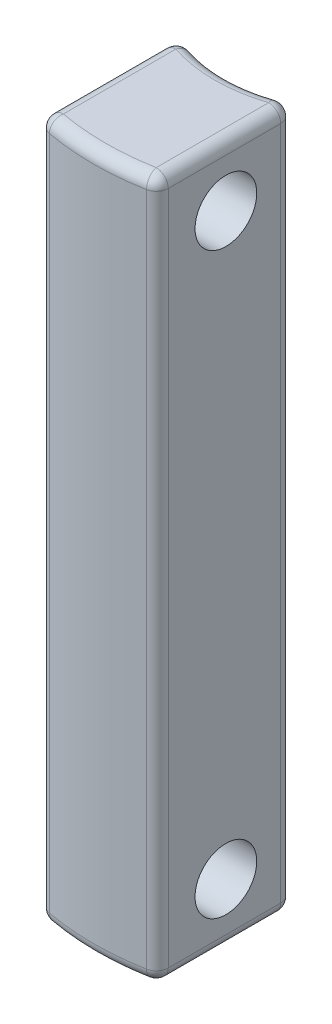
ISO-10303-21;
HEADER;
FILE_DESCRIPTION(('STEP AP214'),'2;1');
FILE_NAME('part.step','',(''),(''),'','','');
FILE_SCHEMA(('AUTOMOTIVE_DESIGN { 1 0 10303 214 1 1 1 1 }'));
ENDSEC;
DATA;
#1=APPLICATION_CONTEXT('core data for automotive mechanical design processes');
#2=APPLICATION_PROTOCOL_DEFINITION('international standard','automotive_design',2000,#1);
#3=PRODUCT_CONTEXT('',#1,'mechanical');
#4=PRODUCT('Part','Part','',(#3));
#5=PRODUCT_RELATED_PRODUCT_CATEGORY('part','',(#4));
#6=PRODUCT_DEFINITION_FORMATION('','',#4);
#7=PRODUCT_DEFINITION_CONTEXT('part definition',#1,'design');
#8=PRODUCT_DEFINITION('design','',#6,#7);
#9=PRODUCT_DEFINITION_SHAPE('','',#8);
#10=(LENGTH_UNIT() NAMED_UNIT(*) SI_UNIT(.MILLI.,.METRE.));
#11=(NAMED_UNIT(*) PLANE_ANGLE_UNIT() SI_UNIT($,.RADIAN.));
#12=(NAMED_UNIT(*) SI_UNIT($,.STERADIAN.) SOLID_ANGLE_UNIT());
#13=UNCERTAINTY_MEASURE_WITH_UNIT(LENGTH_MEASURE(1.E-05),#10,'distance_accuracy_value','');
#14=(GEOMETRIC_REPRESENTATION_CONTEXT(3) GLOBAL_UNCERTAINTY_ASSIGNED_CONTEXT((#13)) GLOBAL_UNIT_ASSIGNED_CONTEXT((#10,
#11,#12)) REPRESENTATION_CONTEXT('',''));
#15=CARTESIAN_POINT('',(0.,0.,0.));
#16=DIRECTION('',(0.,0.,1.));
#17=DIRECTION('',(1.,0.,0.));
#18=AXIS2_PLACEMENT_3D('',#15,#16,#17);
#19=CARTESIAN_POINT('',(0.,-54.61,0.));
#20=DIRECTION('',(0.,1.,0.));
#21=DIRECTION('',(0.,0.,1.));
#22=AXIS2_PLACEMENT_3D('',#19,#20,#21);
#23=CYLINDRICAL_SURFACE('',#22,14.3764);
#24=DIRECTION('',(0.,1.,0.));
#25=VECTOR('',#24,1.);
#26=CARTESIAN_POINT('',(4.492625,-54.61,13.6563976790871));
#27=LINE('',#26,#25);
#28=CARTESIAN_POINT('',(4.492625,17.78,13.6563976790871));
#29=VERTEX_POINT('',#28);
#30=CARTESIAN_POINT('',(4.492625,-53.34,13.6563976790871));
#31=VERTEX_POINT('',#30);
#32=EDGE_CURVE('E199',#29,#31,#27,.F.);
#33=ORIENTED_EDGE('',*,*,#32,.T.);
#34=CARTESIAN_POINT('',(0.,-53.34,0.));
#35=DIRECTION('',(0.,1.,0.));
#36=DIRECTION('',(0.,0.,1.));
#37=AXIS2_PLACEMENT_3D('',#34,#35,#36);
#38=CIRCLE('',#37,14.3764);
#39=CARTESIAN_POINT('',(-4.492625,-53.34,13.6563976790871));
#40=VERTEX_POINT('',#39);
#41=EDGE_CURVE('E204',#31,#40,#38,.F.);
#42=ORIENTED_EDGE('',*,*,#41,.T.);
#43=DIRECTION('',(0.,1.,0.));
#44=VECTOR('',#43,1.);
#45=CARTESIAN_POINT('',(-4.492625,-54.61,13.6563976790871));
#46=LINE('',#45,#44);
#47=CARTESIAN_POINT('',(-4.492625,17.78,13.6563976790871));
#48=VERTEX_POINT('',#47);
#49=EDGE_CURVE('E201',#40,#48,#46,.T.);
#50=ORIENTED_EDGE('',*,*,#49,.T.);
#51=CARTESIAN_POINT('',(0.,17.78,0.));
#52=DIRECTION('',(0.,1.,0.));
#53=DIRECTION('',(0.,0.,1.));
#54=AXIS2_PLACEMENT_3D('',#51,#52,#53);
#55=CIRCLE('',#54,14.3764);
#56=EDGE_CURVE('E197',#48,#29,#55,.T.);
#57=ORIENTED_EDGE('',*,*,#56,.T.);
#58=EDGE_LOOP('',(#33,#42,#50,#57));
#59=FACE_BOUND('',#58,.T.);
#60=ADVANCED_FACE('F32',(#59),#23,.F.);
#61=CARTESIAN_POINT('',(6.1595,-54.61,12.9900514513993));
#62=DIRECTION('',(1.,0.,0.));
#63=DIRECTION('',(0.,0.,-1.));
#64=AXIS2_PLACEMENT_3D('',#61,#62,#63);
#65=PLANE('',#64);
#66=DIRECTION('',(0.,0.,-1.));
#67=VECTOR('',#66,1.);
#68=CARTESIAN_POINT('',(6.1595,17.78,12.9900514513993));
#69=LINE('',#68,#67);
#70=CARTESIAN_POINT('',(6.1595,17.78,14.8627932337767));
#71=VERTEX_POINT('',#70);
#72=CARTESIAN_POINT('',(6.15950000000001,17.78,26.7087340866242));
#73=VERTEX_POINT('',#72);
#74=EDGE_CURVE('E143',#71,#73,#69,.F.);
#75=ORIENTED_EDGE('',*,*,#74,.T.);
#76=DIRECTION('',(0.,1.,0.));
#77=VECTOR('',#76,1.);
#78=CARTESIAN_POINT('',(6.15950000000001,-54.61,26.7087340866242));
#79=LINE('',#78,#77);
#80=CARTESIAN_POINT('',(6.15950000000001,-53.34,26.7087340866242));
#81=VERTEX_POINT('',#80);
#82=EDGE_CURVE('E186',#73,#81,#79,.F.);
#83=ORIENTED_EDGE('',*,*,#82,.T.);
#84=DIRECTION('',(0.,0.,-1.));
#85=VECTOR('',#84,1.);
#86=CARTESIAN_POINT('',(6.1595,-53.34,12.9900514513993));
#87=LINE('',#86,#85);
#88=CARTESIAN_POINT('',(6.1595,-53.34,14.8627932337767));
#89=VERTEX_POINT('',#88);
#90=EDGE_CURVE('E183',#81,#89,#87,.T.);
#91=ORIENTED_EDGE('',*,*,#90,.T.);
#92=DIRECTION('',(0.,1.,0.));
#93=VECTOR('',#92,1.);
#94=CARTESIAN_POINT('',(6.1595,-54.61,14.8627932337767));
#95=LINE('',#94,#93);
#96=EDGE_CURVE('E181',#89,#71,#95,.T.);
#97=ORIENTED_EDGE('',*,*,#96,.T.);
#98=EDGE_LOOP('',(#75,#83,#91,#97));
#99=FACE_BOUND('',#98,.T.);
#100=CARTESIAN_POINT('',(6.1595,-48.26,20.6375));
#101=DIRECTION('',(1.,0.,0.));
#102=DIRECTION('',(0.,0.,-1.));
#103=AXIS2_PLACEMENT_3D('',#100,#101,#102);
#104=CIRCLE('',#103,3.2512);
#105=CARTESIAN_POINT('',(6.1595,-48.26,17.3863));
#106=VERTEX_POINT('',#105);
#107=EDGE_CURVE('E266',#106,#106,#104,.T.);
#108=ORIENTED_EDGE('',*,*,#107,.F.);
#109=EDGE_LOOP('',(#108));
#110=FACE_BOUND('',#109,.T.);
#111=CARTESIAN_POINT('',(6.1595,12.7,20.6375));
#112=DIRECTION('',(1.,0.,0.));
#113=DIRECTION('',(0.,0.,-1.));
#114=AXIS2_PLACEMENT_3D('',#111,#112,#113);
#115=CIRCLE('',#114,3.2512);
#116=CARTESIAN_POINT('',(6.1595,12.7,17.3863));
#117=VERTEX_POINT('',#116);
#118=EDGE_CURVE('E161',#117,#117,#115,.T.);
#119=ORIENTED_EDGE('',*,*,#118,.F.);
#120=EDGE_LOOP('',(#119));
#121=FACE_BOUND('',#120,.T.);
#122=ADVANCED_FACE('F290',(#99,#110,#121),#65,.T.);
#123=CARTESIAN_POINT('',(0.,-54.61,0.));
#124=DIRECTION('',(0.,1.,0.));
#125=DIRECTION('',(0.,0.,1.));
#126=AXIS2_PLACEMENT_3D('',#123,#124,#125);
#127=CYLINDRICAL_SURFACE('',#126,28.4226);
#128=DIRECTION('',(0.,1.,0.));
#129=VECTOR('',#128,1.);
#130=CARTESIAN_POINT('',(-5.11819504209541,-54.61,27.9579732861857));
#131=LINE('',#130,#129);
#132=CARTESIAN_POINT('',(-5.11819504209541,17.78,27.9579732861856));
#133=VERTEX_POINT('',#132);
#134=CARTESIAN_POINT('',(-5.11819504209541,-53.34,27.9579732861856));
#135=VERTEX_POINT('',#134);
#136=EDGE_CURVE('E41',#133,#135,#131,.F.);
#137=ORIENTED_EDGE('',*,*,#136,.T.);
#138=CARTESIAN_POINT('',(0.,-53.34,0.));
#139=DIRECTION('',(0.,1.,0.));
#140=DIRECTION('',(0.,0.,1.));
#141=AXIS2_PLACEMENT_3D('',#138,#139,#140);
#142=CIRCLE('',#141,28.4226);
#143=CARTESIAN_POINT('',(5.11819504209542,-53.34,27.9579732861856));
#144=VERTEX_POINT('',#143);
#145=EDGE_CURVE('E11',#135,#144,#142,.T.);
#146=ORIENTED_EDGE('',*,*,#145,.T.);
#147=DIRECTION('',(0.,1.,0.));
#148=VECTOR('',#147,1.);
#149=CARTESIAN_POINT('',(5.11819504209542,-54.61,27.9579732861856));
#150=LINE('',#149,#148);
#151=CARTESIAN_POINT('',(5.11819504209542,17.78,27.9579732861856));
#152=VERTEX_POINT('',#151);
#153=EDGE_CURVE('E208',#144,#152,#150,.T.);
#154=ORIENTED_EDGE('',*,*,#153,.T.);
#155=CARTESIAN_POINT('',(0.,17.78,0.));
#156=DIRECTION('',(0.,1.,0.));
#157=DIRECTION('',(0.,0.,1.));
#158=AXIS2_PLACEMENT_3D('',#155,#156,#157);
#159=CIRCLE('',#158,28.4226);
#160=EDGE_CURVE('E206',#152,#133,#159,.F.);
#161=ORIENTED_EDGE('',*,*,#160,.T.);
#162=EDGE_LOOP('',(#137,#146,#154,#161));
#163=FACE_BOUND('',#162,.T.);
#164=ADVANCED_FACE('F281',(#163),#127,.T.);
#165=CARTESIAN_POINT('',(-6.1595,-54.61,12.9900514513993));
#166=DIRECTION('',(-1.,0.,0.));
#167=DIRECTION('',(0.,0.,1.));
#168=AXIS2_PLACEMENT_3D('',#165,#166,#167);
#169=PLANE('',#168);
#170=DIRECTION('',(0.,0.,1.));
#171=VECTOR('',#170,1.);
#172=CARTESIAN_POINT('',(-6.1595,17.78,12.9900514513993));
#173=LINE('',#172,#171);
#174=CARTESIAN_POINT('',(-6.1595,17.78,26.7087340866242));
#175=VERTEX_POINT('',#174);
#176=CARTESIAN_POINT('',(-6.1595,17.78,14.8627932337767));
#177=VERTEX_POINT('',#176);
#178=EDGE_CURVE('E176',#175,#177,#173,.F.);
#179=ORIENTED_EDGE('',*,*,#178,.T.);
#180=DIRECTION('',(0.,1.,0.));
#181=VECTOR('',#180,1.);
#182=CARTESIAN_POINT('',(-6.1595,-54.61,14.8627932337767));
#183=LINE('',#182,#181);
#184=CARTESIAN_POINT('',(-6.1595,-53.34,14.8627932337767));
#185=VERTEX_POINT('',#184);
#186=EDGE_CURVE('E179',#177,#185,#183,.F.);
#187=ORIENTED_EDGE('',*,*,#186,.T.);
#188=DIRECTION('',(0.,0.,1.));
#189=VECTOR('',#188,1.);
#190=CARTESIAN_POINT('',(-6.1595,-53.34,27.7471575212669));
#191=LINE('',#190,#189);
#192=CARTESIAN_POINT('',(-6.1595,-53.34,26.7087340866242));
#193=VERTEX_POINT('',#192);
#194=EDGE_CURVE('E174',#185,#193,#191,.T.);
#195=ORIENTED_EDGE('',*,*,#194,.T.);
#196=DIRECTION('',(0.,1.,0.));
#197=VECTOR('',#196,1.);
#198=CARTESIAN_POINT('',(-6.1595,-54.61,26.7087340866242));
#199=LINE('',#198,#197);
#200=EDGE_CURVE('E172',#193,#175,#199,.T.);
#201=ORIENTED_EDGE('',*,*,#200,.T.);
#202=EDGE_LOOP('',(#179,#187,#195,#201));
#203=FACE_BOUND('',#202,.T.);
#204=CARTESIAN_POINT('',(-6.1595,-48.26,20.6375));
#205=DIRECTION('',(-1.,0.,0.));
#206=DIRECTION('',(0.,0.,1.));
#207=AXIS2_PLACEMENT_3D('',#204,#205,#206);
#208=CIRCLE('',#207,3.2512);
#209=CARTESIAN_POINT('',(-6.1595,-48.26,17.3863));
#210=VERTEX_POINT('',#209);
#211=EDGE_CURVE('E167',#210,#210,#208,.T.);
#212=ORIENTED_EDGE('',*,*,#211,.F.);
#213=EDGE_LOOP('',(#212));
#214=FACE_BOUND('',#213,.T.);
#215=CARTESIAN_POINT('',(-6.1595,12.7,20.6375));
#216=DIRECTION('',(-1.,0.,0.));
#217=DIRECTION('',(0.,0.,1.));
#218=AXIS2_PLACEMENT_3D('',#215,#216,#217);
#219=CIRCLE('',#218,3.2512);
#220=CARTESIAN_POINT('',(-6.1595,12.7,17.3863));
#221=VERTEX_POINT('',#220);
#222=EDGE_CURVE('E164',#221,#221,#219,.T.);
#223=ORIENTED_EDGE('',*,*,#222,.F.);
#224=EDGE_LOOP('',(#223));
#225=FACE_BOUND('',#224,.T.);
#226=ADVANCED_FACE('F278',(#203,#214,#225),#169,.T.);
#227=CARTESIAN_POINT('',(0.,-54.61,0.));
#228=DIRECTION('',(0.,1.,0.));
#229=DIRECTION('',(0.,0.,1.));
#230=AXIS2_PLACEMENT_3D('',#227,#228,#229);
#231=PLANE('',#230);
#232=DIRECTION('',(0.,0.,-1.));
#233=VECTOR('',#232,1.);
#234=CARTESIAN_POINT('',(4.88950000000001,-54.61,27.7471575212669));
#235=LINE('',#234,#233);
#236=CARTESIAN_POINT('',(4.8895,-54.61,14.8627932337767));
#237=VERTEX_POINT('',#236);
#238=CARTESIAN_POINT('',(4.88950000000001,-54.61,26.7087340866242));
#239=VERTEX_POINT('',#238);
#240=EDGE_CURVE('E190',#237,#239,#235,.F.);
#241=ORIENTED_EDGE('',*,*,#240,.T.);
#242=CARTESIAN_POINT('',(0.,-54.61,0.));
#243=DIRECTION('',(0.,1.,0.));
#244=DIRECTION('',(0.,0.,1.));
#245=AXIS2_PLACEMENT_3D('',#242,#243,#244);
#246=CIRCLE('',#245,27.1526);
#247=CARTESIAN_POINT('',(-4.8895,-54.61,26.7087340866242));
#248=VERTEX_POINT('',#247);
#249=EDGE_CURVE('E195',#239,#248,#246,.F.);
#250=ORIENTED_EDGE('',*,*,#249,.T.);
#251=DIRECTION('',(0.,0.,1.));
#252=VECTOR('',#251,1.);
#253=CARTESIAN_POINT('',(-4.8895,-54.61,12.9900514513993));
#254=LINE('',#253,#252);
#255=CARTESIAN_POINT('',(-4.8895,-54.61,14.8627932337767));
#256=VERTEX_POINT('',#255);
#257=EDGE_CURVE('E192',#248,#256,#254,.F.);
#258=ORIENTED_EDGE('',*,*,#257,.T.);
#259=CARTESIAN_POINT('',(0.,-54.61,0.));
#260=DIRECTION('',(0.,1.,0.));
#261=DIRECTION('',(0.,0.,1.));
#262=AXIS2_PLACEMENT_3D('',#259,#260,#261);
#263=CIRCLE('',#262,15.6464);
#264=EDGE_CURVE('E188',#256,#237,#263,.T.);
#265=ORIENTED_EDGE('',*,*,#264,.T.);
#266=EDGE_LOOP('',(#241,#250,#258,#265));
#267=FACE_BOUND('',#266,.T.);
#268=ADVANCED_FACE('F280',(#267),#231,.F.);
#269=CARTESIAN_POINT('',(0.,19.05,0.));
#270=DIRECTION('',(0.,1.,0.));
#271=DIRECTION('',(0.,0.,1.));
#272=AXIS2_PLACEMENT_3D('',#269,#270,#271);
#273=PLANE('',#272);
#274=DIRECTION('',(0.,0.,1.));
#275=VECTOR('',#274,1.);
#276=CARTESIAN_POINT('',(-4.8895,19.05,0.));
#277=LINE('',#276,#275);
#278=CARTESIAN_POINT('',(-4.8895,19.05,14.8627932337767));
#279=VERTEX_POINT('',#278);
#280=CARTESIAN_POINT('',(-4.8895,19.05,26.7087340866242));
#281=VERTEX_POINT('',#280);
#282=EDGE_CURVE('E135',#279,#281,#277,.T.);
#283=ORIENTED_EDGE('',*,*,#282,.T.);
#284=CARTESIAN_POINT('',(0.,19.05,0.));
#285=DIRECTION('',(0.,1.,0.));
#286=DIRECTION('',(0.,0.,1.));
#287=AXIS2_PLACEMENT_3D('',#284,#285,#286);
#288=CIRCLE('',#287,27.1526);
#289=CARTESIAN_POINT('',(4.88950000000001,19.05,26.7087340866242));
#290=VERTEX_POINT('',#289);
#291=EDGE_CURVE('E131',#281,#290,#288,.T.);
#292=ORIENTED_EDGE('',*,*,#291,.T.);
#293=DIRECTION('',(0.,0.,-1.));
#294=VECTOR('',#293,1.);
#295=CARTESIAN_POINT('',(4.8895,19.05,0.));
#296=LINE('',#295,#294);
#297=CARTESIAN_POINT('',(4.8895,19.05,14.8627932337767));
#298=VERTEX_POINT('',#297);
#299=EDGE_CURVE('E123',#290,#298,#296,.T.);
#300=ORIENTED_EDGE('',*,*,#299,.T.);
#301=CARTESIAN_POINT('',(0.,19.05,0.));
#302=DIRECTION('',(0.,1.,0.));
#303=DIRECTION('',(0.,0.,1.));
#304=AXIS2_PLACEMENT_3D('',#301,#302,#303);
#305=CIRCLE('',#304,15.6464);
#306=EDGE_CURVE('E128',#298,#279,#305,.F.);
#307=ORIENTED_EDGE('',*,*,#306,.T.);
#308=EDGE_LOOP('',(#283,#292,#300,#307));
#309=FACE_BOUND('',#308,.T.);
#310=ADVANCED_FACE('F126',(#309),#273,.T.);
#311=CARTESIAN_POINT('',(-9.525,12.7,20.6375));
#312=DIRECTION('',(1.,0.,0.));
#313=DIRECTION('',(0.,0.,-1.));
#314=AXIS2_PLACEMENT_3D('',#311,#312,#313);
#315=CYLINDRICAL_SURFACE('',#314,3.2512);
#316=CARTESIAN_POINT('',(6.1595,12.7,17.3863));
#317=CARTESIAN_POINT('',(6.03117708333333,12.7,17.3863));
#318=CARTESIAN_POINT('',(5.90285416666667,12.7,17.3863));
#319=CARTESIAN_POINT('',(5.64620833333333,12.7,17.3863));
#320=CARTESIAN_POINT('',(5.51788541666667,12.7,17.3863));
#321=CARTESIAN_POINT('',(5.26123958333334,12.7,17.3863));
#322=CARTESIAN_POINT('',(5.13291666666667,12.7,17.3863));
#323=CARTESIAN_POINT('',(4.87627083333333,12.7,17.3863));
#324=CARTESIAN_POINT('',(4.74794791666667,12.7,17.3863));
#325=CARTESIAN_POINT('',(4.49130208333334,12.7,17.3863));
#326=CARTESIAN_POINT('',(4.36297916666667,12.7,17.3863));
#327=CARTESIAN_POINT('',(4.10633333333333,12.7,17.3863));
#328=CARTESIAN_POINT('',(3.97801041666667,12.7,17.3863));
#329=CARTESIAN_POINT('',(3.72136458333333,12.7,17.3863));
#330=CARTESIAN_POINT('',(3.59304166666667,12.7,17.3863));
#331=CARTESIAN_POINT('',(3.33639583333334,12.7,17.3863));
#332=CARTESIAN_POINT('',(3.20807291666667,12.7,17.3863));
#333=CARTESIAN_POINT('',(2.95142708333334,12.7,17.3863));
#334=CARTESIAN_POINT('',(2.82310416666667,12.7,17.3863));
#335=CARTESIAN_POINT('',(2.56645833333334,12.7,17.3863));
#336=CARTESIAN_POINT('',(2.43813541666667,12.7,17.3863));
#337=CARTESIAN_POINT('',(2.18148958333333,12.7,17.3863));
#338=CARTESIAN_POINT('',(2.05316666666667,12.7,17.3863));
#339=CARTESIAN_POINT('',(1.79652083333334,12.7,17.3863));
#340=CARTESIAN_POINT('',(1.66819791666667,12.7,17.3863));
#341=CARTESIAN_POINT('',(1.41155208333333,12.7,17.3863));
#342=CARTESIAN_POINT('',(1.28322916666667,12.7,17.3863));
#343=CARTESIAN_POINT('',(1.02658333333333,12.7,17.3863));
#344=CARTESIAN_POINT('',(0.898260416666668,12.7,17.3863));
#345=CARTESIAN_POINT('',(0.641614583333335,12.7,17.3863));
#346=CARTESIAN_POINT('',(0.513291666666669,12.7,17.3863));
#347=CARTESIAN_POINT('',(0.256645833333336,12.7,17.3863));
#348=CARTESIAN_POINT('',(0.128322916666669,12.7,17.3863));
#349=CARTESIAN_POINT('',(-0.128322916666665,12.7,17.3863));
#350=CARTESIAN_POINT('',(-0.256645833333332,12.7,17.3863));
#351=CARTESIAN_POINT('',(-0.513291666666665,12.7,17.3863));
#352=CARTESIAN_POINT('',(-0.641614583333332,12.7,17.3863));
#353=CARTESIAN_POINT('',(-0.898260416666664,12.7,17.3863));
#354=CARTESIAN_POINT('',(-1.02658333333333,12.7,17.3863));
#355=CARTESIAN_POINT('',(-1.28322916666666,12.7,17.3863));
#356=CARTESIAN_POINT('',(-1.41155208333333,12.7,17.3863));
#357=CARTESIAN_POINT('',(-1.66819791666666,12.7,17.3863));
#358=CARTESIAN_POINT('',(-1.79652083333333,12.7,17.3863));
#359=CARTESIAN_POINT('',(-2.05316666666666,12.7,17.3863));
#360=CARTESIAN_POINT('',(-2.18148958333333,12.7,17.3863));
#361=CARTESIAN_POINT('',(-2.43813541666666,12.7,17.3863));
#362=CARTESIAN_POINT('',(-2.56645833333333,12.7,17.3863));
#363=CARTESIAN_POINT('',(-2.82310416666666,12.7,17.3863));
#364=CARTESIAN_POINT('',(-2.95142708333333,12.7,17.3863));
#365=CARTESIAN_POINT('',(-3.20807291666666,12.7,17.3863));
#366=CARTESIAN_POINT('',(-3.33639583333333,12.7,17.3863));
#367=CARTESIAN_POINT('',(-3.59304166666666,12.7,17.3863));
#368=CARTESIAN_POINT('',(-3.72136458333333,12.7,17.3863));
#369=CARTESIAN_POINT('',(-3.97801041666666,12.7,17.3863));
#370=CARTESIAN_POINT('',(-4.10633333333333,12.7,17.3863));
#371=CARTESIAN_POINT('',(-4.36297916666666,12.7,17.3863));
#372=CARTESIAN_POINT('',(-4.49130208333333,12.7,17.3863));
#373=CARTESIAN_POINT('',(-4.74794791666666,12.7,17.3863));
#374=CARTESIAN_POINT('',(-4.87627083333333,12.7,17.3863));
#375=CARTESIAN_POINT('',(-5.13291666666666,12.7,17.3863));
#376=CARTESIAN_POINT('',(-5.26123958333333,12.7,17.3863));
#377=CARTESIAN_POINT('',(-5.51788541666666,12.7,17.3863));
#378=CARTESIAN_POINT('',(-5.64620833333333,12.7,17.3863));
#379=CARTESIAN_POINT('',(-5.90285416666666,12.7,17.3863));
#380=CARTESIAN_POINT('',(-6.03117708333333,12.7,17.3863));
#381=CARTESIAN_POINT('',(-6.1595,12.7,17.3863));
#382=B_SPLINE_CURVE_WITH_KNOTS('',3,(#316,#317,#318,#319,#320,#321,#322,#323,#324,#325,#326,
#327,#328,#329,#330,#331,#332,#333,#334,#335,#336,#337,#338,#339,#340,#341,#342,#343,#344,#345,
#346,#347,#348,#349,#350,#351,#352,#353,#354,#355,#356,#357,#358,#359,#360,#361,#362,#363,#364,
#365,#366,#367,#368,#369,#370,#371,#372,#373,#374,#375,#376,#377,#378,#379,#380,#381),
.UNSPECIFIED.,.F.,.F.,(4,2,2,2,2,2,2,2,2,2,2,2,2,2,2,2,2,2,2,2,2,2,2,2,2,2,2,2,2,2,2,2,4),(0.,
0.384968749999999,0.769937499999998,1.15490625,1.539875,1.92484375,2.3098125,2.69478125,3.07975,
3.46471875,3.8496875,4.23465625,4.619625,5.00459375,5.3895625,5.77453125,6.1595,6.54446875,
6.9294375,7.31440625,7.699375,8.08434375,8.4693125,8.85428125,9.23925,9.62421875,10.0091875,
10.39415625,10.779125,11.16409375,11.5490625,11.93403125,12.319),.UNSPECIFIED.);
#383=EDGE_CURVE('BSEAM276',#117,#221,#382,.T.);
#384=ORIENTED_EDGE('',*,*,#118,.T.);
#385=ORIENTED_EDGE('',*,*,#222,.T.);
#386=ORIENTED_EDGE('',*,*,#383,.T.);
#387=ORIENTED_EDGE('',*,*,#383,.F.);
#388=EDGE_LOOP('',(#384,#386,#385,#387));
#389=FACE_BOUND('',#388,.T.);
#390=ADVANCED_FACE('F276',(#389),#315,.F.);
#391=CARTESIAN_POINT('',(-9.525,-48.26,20.6375));
#392=DIRECTION('',(1.,0.,0.));
#393=DIRECTION('',(0.,0.,-1.));
#394=AXIS2_PLACEMENT_3D('',#391,#392,#393);
#395=CYLINDRICAL_SURFACE('',#394,3.2512);
#396=CARTESIAN_POINT('',(6.1595,-48.26,17.3863));
#397=CARTESIAN_POINT('',(6.03117708333333,-48.26,17.3863));
#398=CARTESIAN_POINT('',(5.90285416666667,-48.26,17.3863));
#399=CARTESIAN_POINT('',(5.64620833333333,-48.26,17.3863));
#400=CARTESIAN_POINT('',(5.51788541666667,-48.26,17.3863));
#401=CARTESIAN_POINT('',(5.26123958333334,-48.26,17.3863));
#402=CARTESIAN_POINT('',(5.13291666666667,-48.26,17.3863));
#403=CARTESIAN_POINT('',(4.87627083333333,-48.26,17.3863));
#404=CARTESIAN_POINT('',(4.74794791666667,-48.26,17.3863));
#405=CARTESIAN_POINT('',(4.49130208333334,-48.26,17.3863));
#406=CARTESIAN_POINT('',(4.36297916666667,-48.26,17.3863));
#407=CARTESIAN_POINT('',(4.10633333333333,-48.26,17.3863));
#408=CARTESIAN_POINT('',(3.97801041666667,-48.26,17.3863));
#409=CARTESIAN_POINT('',(3.72136458333333,-48.26,17.3863));
#410=CARTESIAN_POINT('',(3.59304166666667,-48.26,17.3863));
#411=CARTESIAN_POINT('',(3.33639583333334,-48.26,17.3863));
#412=CARTESIAN_POINT('',(3.20807291666667,-48.26,17.3863));
#413=CARTESIAN_POINT('',(2.95142708333334,-48.26,17.3863));
#414=CARTESIAN_POINT('',(2.82310416666667,-48.26,17.3863));
#415=CARTESIAN_POINT('',(2.56645833333334,-48.26,17.3863));
#416=CARTESIAN_POINT('',(2.43813541666667,-48.26,17.3863));
#417=CARTESIAN_POINT('',(2.18148958333333,-48.26,17.3863));
#418=CARTESIAN_POINT('',(2.05316666666667,-48.26,17.3863));
#419=CARTESIAN_POINT('',(1.79652083333334,-48.26,17.3863));
#420=CARTESIAN_POINT('',(1.66819791666667,-48.26,17.3863));
#421=CARTESIAN_POINT('',(1.41155208333333,-48.26,17.3863));
#422=CARTESIAN_POINT('',(1.28322916666667,-48.26,17.3863));
#423=CARTESIAN_POINT('',(1.02658333333333,-48.26,17.3863));
#424=CARTESIAN_POINT('',(0.898260416666668,-48.26,17.3863));
#425=CARTESIAN_POINT('',(0.641614583333335,-48.26,17.3863));
#426=CARTESIAN_POINT('',(0.513291666666669,-48.26,17.3863));
#427=CARTESIAN_POINT('',(0.256645833333336,-48.26,17.3863));
#428=CARTESIAN_POINT('',(0.128322916666669,-48.26,17.3863));
#429=CARTESIAN_POINT('',(-0.128322916666665,-48.26,17.3863));
#430=CARTESIAN_POINT('',(-0.256645833333332,-48.26,17.3863));
#431=CARTESIAN_POINT('',(-0.513291666666665,-48.26,17.3863));
#432=CARTESIAN_POINT('',(-0.641614583333332,-48.26,17.3863));
#433=CARTESIAN_POINT('',(-0.898260416666664,-48.26,17.3863));
#434=CARTESIAN_POINT('',(-1.02658333333333,-48.26,17.3863));
#435=CARTESIAN_POINT('',(-1.28322916666666,-48.26,17.3863));
#436=CARTESIAN_POINT('',(-1.41155208333333,-48.26,17.3863));
#437=CARTESIAN_POINT('',(-1.66819791666666,-48.26,17.3863));
#438=CARTESIAN_POINT('',(-1.79652083333333,-48.26,17.3863));
#439=CARTESIAN_POINT('',(-2.05316666666666,-48.26,17.3863));
#440=CARTESIAN_POINT('',(-2.18148958333333,-48.26,17.3863));
#441=CARTESIAN_POINT('',(-2.43813541666666,-48.26,17.3863));
#442=CARTESIAN_POINT('',(-2.56645833333333,-48.26,17.3863));
#443=CARTESIAN_POINT('',(-2.82310416666666,-48.26,17.3863));
#444=CARTESIAN_POINT('',(-2.95142708333333,-48.26,17.3863));
#445=CARTESIAN_POINT('',(-3.20807291666666,-48.26,17.3863));
#446=CARTESIAN_POINT('',(-3.33639583333333,-48.26,17.3863));
#447=CARTESIAN_POINT('',(-3.59304166666666,-48.26,17.3863));
#448=CARTESIAN_POINT('',(-3.72136458333333,-48.26,17.3863));
#449=CARTESIAN_POINT('',(-3.97801041666666,-48.26,17.3863));
#450=CARTESIAN_POINT('',(-4.10633333333333,-48.26,17.3863));
#451=CARTESIAN_POINT('',(-4.36297916666666,-48.26,17.3863));
#452=CARTESIAN_POINT('',(-4.49130208333333,-48.26,17.3863));
#453=CARTESIAN_POINT('',(-4.74794791666666,-48.26,17.3863));
#454=CARTESIAN_POINT('',(-4.87627083333333,-48.26,17.3863));
#455=CARTESIAN_POINT('',(-5.13291666666666,-48.26,17.3863));
#456=CARTESIAN_POINT('',(-5.26123958333333,-48.26,17.3863));
#457=CARTESIAN_POINT('',(-5.51788541666666,-48.26,17.3863));
#458=CARTESIAN_POINT('',(-5.64620833333333,-48.26,17.3863));
#459=CARTESIAN_POINT('',(-5.90285416666666,-48.26,17.3863));
#460=CARTESIAN_POINT('',(-6.03117708333333,-48.26,17.3863));
#461=CARTESIAN_POINT('',(-6.1595,-48.26,17.3863));
#462=B_SPLINE_CURVE_WITH_KNOTS('',3,(#396,#397,#398,#399,#400,#401,#402,#403,#404,#405,#406,
#407,#408,#409,#410,#411,#412,#413,#414,#415,#416,#417,#418,#419,#420,#421,#422,#423,#424,#425,
#426,#427,#428,#429,#430,#431,#432,#433,#434,#435,#436,#437,#438,#439,#440,#441,#442,#443,#444,
#445,#446,#447,#448,#449,#450,#451,#452,#453,#454,#455,#456,#457,#458,#459,#460,#461),
.UNSPECIFIED.,.F.,.F.,(4,2,2,2,2,2,2,2,2,2,2,2,2,2,2,2,2,2,2,2,2,2,2,2,2,2,2,2,2,2,2,2,4),(0.,
0.384968749999999,0.769937499999998,1.15490625,1.539875,1.92484375,2.3098125,2.69478125,3.07975,
3.46471875,3.8496875,4.23465625,4.619625,5.00459375,5.3895625,5.77453125,6.1595,6.54446875,
6.9294375,7.31440625,7.699375,8.08434375,8.4693125,8.85428125,9.23925,9.62421875,10.0091875,
10.39415625,10.779125,11.16409375,11.5490625,11.93403125,12.319),.UNSPECIFIED.);
#463=EDGE_CURVE('BSEAM370',#106,#210,#462,.T.);
#464=ORIENTED_EDGE('',*,*,#107,.T.);
#465=ORIENTED_EDGE('',*,*,#211,.T.);
#466=ORIENTED_EDGE('',*,*,#463,.T.);
#467=ORIENTED_EDGE('',*,*,#463,.F.);
#468=EDGE_LOOP('',(#464,#466,#465,#467));
#469=FACE_BOUND('',#468,.T.);
#470=ADVANCED_FACE('F370',(#469),#395,.F.);
#471=CARTESIAN_POINT('',(4.8895,-53.34,12.9900514513993));
#472=DIRECTION('',(0.,0.,1.));
#473=DIRECTION('',(1.,0.,0.));
#474=AXIS2_PLACEMENT_3D('',#471,#472,#473);
#475=CYLINDRICAL_SURFACE('',#474,1.27);
#476=CARTESIAN_POINT('',(4.8895,-53.34,14.8627932337767));
#477=DIRECTION('',(0.,0.,-1.));
#478=DIRECTION('',(0.,1.,0.));
#479=AXIS2_PLACEMENT_3D('',#476,#477,#478);
#480=CIRCLE('',#479,1.27);
#481=EDGE_CURVE('E36',#89,#237,#480,.T.);
#482=ORIENTED_EDGE('',*,*,#481,.F.);
#483=ORIENTED_EDGE('',*,*,#90,.F.);
#484=CARTESIAN_POINT('',(4.88950000000001,-53.34,26.7087340866242));
#485=DIRECTION('',(0.,0.,1.));
#486=DIRECTION('',(1.,0.,0.));
#487=AXIS2_PLACEMENT_3D('',#484,#485,#486);
#488=CIRCLE('',#487,1.27);
#489=EDGE_CURVE('E254',#239,#81,#488,.T.);
#490=ORIENTED_EDGE('',*,*,#489,.F.);
#491=ORIENTED_EDGE('',*,*,#240,.F.);
#492=EDGE_LOOP('',(#482,#483,#490,#491));
#493=FACE_BOUND('',#492,.T.);
#494=ADVANCED_FACE('F34',(#493),#475,.T.);
#495=CARTESIAN_POINT('',(4.8895,-53.34,14.8627932337767));
#496=DIRECTION('',(0.,0.,1.));
#497=DIRECTION('',(1.,0.,0.));
#498=AXIS2_PLACEMENT_3D('',#495,#496,#497);
#499=SPHERICAL_SURFACE('',#498,1.27);
#500=CARTESIAN_POINT('',(4.8895,-53.34,14.8627932337767));
#501=DIRECTION('',(0.,-1.,0.));
#502=DIRECTION('',(0.,0.,-1.));
#503=AXIS2_PLACEMENT_3D('',#500,#501,#502);
#504=CIRCLE('',#503,1.27);
#505=EDGE_CURVE('E249',#89,#31,#504,.F.);
#506=ORIENTED_EDGE('',*,*,#505,.F.);
#507=ORIENTED_EDGE('',*,*,#481,.T.);
#508=CARTESIAN_POINT('',(4.8895,-53.34,14.8627932337767));
#509=DIRECTION('',(0.949917759598166,0.,-0.3125));
#510=DIRECTION('',(-0.3125,0.,-0.949917759598166));
#511=AXIS2_PLACEMENT_3D('',#508,#509,#510);
#512=CIRCLE('',#511,1.27);
#513=EDGE_CURVE('E252',#31,#237,#512,.F.);
#514=ORIENTED_EDGE('',*,*,#513,.F.);
#515=EDGE_LOOP('',(#506,#507,#514));
#516=FACE_BOUND('',#515,.T.);
#517=ADVANCED_FACE('F365',(#516),#499,.T.);
#518=CARTESIAN_POINT('',(4.88950000000001,-53.34,26.7087340866242));
#519=DIRECTION('',(0.,0.,1.));
#520=DIRECTION('',(1.,0.,0.));
#521=AXIS2_PLACEMENT_3D('',#518,#519,#520);
#522=SPHERICAL_SURFACE('',#521,1.27);
#523=CARTESIAN_POINT('',(4.8895,-53.34,26.7087340866242));
#524=DIRECTION('',(0.983652913040525,0.,-0.180074836295604));
#525=DIRECTION('',(-0.180074836295604,0.,-0.983652913040526));
#526=AXIS2_PLACEMENT_3D('',#523,#524,#525);
#527=CIRCLE('',#526,1.27);
#528=EDGE_CURVE('E244',#239,#144,#527,.F.);
#529=ORIENTED_EDGE('',*,*,#528,.F.);
#530=ORIENTED_EDGE('',*,*,#489,.T.);
#531=CARTESIAN_POINT('',(4.88950000000001,-53.34,26.7087340866242));
#532=DIRECTION('',(0.,-1.,0.));
#533=DIRECTION('',(0.,0.,-1.));
#534=AXIS2_PLACEMENT_3D('',#531,#532,#533);
#535=CIRCLE('',#534,1.27);
#536=EDGE_CURVE('E246',#144,#81,#535,.F.);
#537=ORIENTED_EDGE('',*,*,#536,.F.);
#538=EDGE_LOOP('',(#529,#530,#537));
#539=FACE_BOUND('',#538,.T.);
#540=ADVANCED_FACE('F362',(#539),#522,.T.);
#541=CARTESIAN_POINT('',(0.,-53.34,0.));
#542=DIRECTION('',(0.,1.,0.));
#543=DIRECTION('',(0.,0.,1.));
#544=AXIS2_PLACEMENT_3D('',#541,#542,#543);
#545=TOROIDAL_SURFACE('',#544,15.6464,1.27);
#546=ORIENTED_EDGE('',*,*,#513,.T.);
#547=ORIENTED_EDGE('',*,*,#264,.F.);
#548=CARTESIAN_POINT('',(-4.8895,-53.34,14.8627932337768));
#549=DIRECTION('',(-0.949917759598167,0.,-0.3125));
#550=DIRECTION('',(-0.3125,0.,0.949917759598167));
#551=AXIS2_PLACEMENT_3D('',#548,#549,#550);
#552=CIRCLE('',#551,1.27);
#553=EDGE_CURVE('E239',#40,#256,#552,.T.);
#554=ORIENTED_EDGE('',*,*,#553,.F.);
#555=ORIENTED_EDGE('',*,*,#41,.F.);
#556=EDGE_LOOP('',(#546,#547,#554,#555));
#557=FACE_BOUND('',#556,.T.);
#558=ADVANCED_FACE('F358',(#557),#545,.T.);
#559=CARTESIAN_POINT('',(4.8895,-54.61,14.8627932337767));
#560=DIRECTION('',(0.,1.,0.));
#561=DIRECTION('',(0.,0.,1.));
#562=AXIS2_PLACEMENT_3D('',#559,#560,#561);
#563=CYLINDRICAL_SURFACE('',#562,1.27);
#564=ORIENTED_EDGE('',*,*,#505,.T.);
#565=ORIENTED_EDGE('',*,*,#32,.F.);
#566=CARTESIAN_POINT('',(4.8895,17.78,14.8627932337767));
#567=DIRECTION('',(0.,1.,0.));
#568=DIRECTION('',(0.,0.,1.));
#569=AXIS2_PLACEMENT_3D('',#566,#567,#568);
#570=CIRCLE('',#569,1.27);
#571=EDGE_CURVE('E147',#71,#29,#570,.T.);
#572=ORIENTED_EDGE('',*,*,#571,.F.);
#573=ORIENTED_EDGE('',*,*,#96,.F.);
#574=EDGE_LOOP('',(#564,#565,#572,#573));
#575=FACE_BOUND('',#574,.T.);
#576=ADVANCED_FACE('F355',(#575),#563,.T.);
#577=CARTESIAN_POINT('',(4.8895,17.78,0.));
#578=DIRECTION('',(0.,0.,-1.));
#579=DIRECTION('',(-1.,0.,0.));
#580=AXIS2_PLACEMENT_3D('',#577,#578,#579);
#581=CYLINDRICAL_SURFACE('',#580,1.27);
#582=CARTESIAN_POINT('',(4.88950000000001,17.78,26.7087340866242));
#583=DIRECTION('',(0.,0.,1.));
#584=DIRECTION('',(0.,-1.,0.));
#585=AXIS2_PLACEMENT_3D('',#582,#583,#584);
#586=CIRCLE('',#585,1.27);
#587=EDGE_CURVE('E148',#73,#290,#586,.T.);
#588=ORIENTED_EDGE('',*,*,#587,.F.);
#589=ORIENTED_EDGE('',*,*,#74,.F.);
#590=CARTESIAN_POINT('',(4.8895,17.78,14.8627932337768));
#591=DIRECTION('',(0.,0.,-1.));
#592=DIRECTION('',(-1.,0.,0.));
#593=AXIS2_PLACEMENT_3D('',#590,#591,#592);
#594=CIRCLE('',#593,1.27);
#595=EDGE_CURVE('E139',#298,#71,#594,.T.);
#596=ORIENTED_EDGE('',*,*,#595,.F.);
#597=ORIENTED_EDGE('',*,*,#299,.F.);
#598=EDGE_LOOP('',(#588,#589,#596,#597));
#599=FACE_BOUND('',#598,.T.);
#600=ADVANCED_FACE('F141',(#599),#581,.T.);
#601=CARTESIAN_POINT('',(4.88950000000001,-54.61,26.7087340866242));
#602=DIRECTION('',(0.,1.,0.));
#603=DIRECTION('',(0.,0.,1.));
#604=AXIS2_PLACEMENT_3D('',#601,#602,#603);
#605=CYLINDRICAL_SURFACE('',#604,1.27);
#606=ORIENTED_EDGE('',*,*,#536,.T.);
#607=ORIENTED_EDGE('',*,*,#82,.F.);
#608=CARTESIAN_POINT('',(4.8895,17.78,26.7087340866242));
#609=DIRECTION('',(0.,1.,0.));
#610=DIRECTION('',(-1.,0.,0.));
#611=AXIS2_PLACEMENT_3D('',#608,#609,#610);
#612=CIRCLE('',#611,1.27);
#613=EDGE_CURVE('E235',#152,#73,#612,.T.);
#614=ORIENTED_EDGE('',*,*,#613,.F.);
#615=ORIENTED_EDGE('',*,*,#153,.F.);
#616=EDGE_LOOP('',(#606,#607,#614,#615));
#617=FACE_BOUND('',#616,.T.);
#618=ADVANCED_FACE('F348',(#617),#605,.T.);
#619=CARTESIAN_POINT('',(0.,-53.34,0.));
#620=DIRECTION('',(0.,1.,0.));
#621=DIRECTION('',(0.,0.,1.));
#622=AXIS2_PLACEMENT_3D('',#619,#620,#621);
#623=TOROIDAL_SURFACE('',#622,27.1526,1.27);
#624=ORIENTED_EDGE('',*,*,#528,.T.);
#625=ORIENTED_EDGE('',*,*,#145,.F.);
#626=CARTESIAN_POINT('',(-4.8895,-53.34,26.7087340866242));
#627=DIRECTION('',(-0.983652913040525,0.,-0.180074836295604));
#628=DIRECTION('',(-0.180074836295604,0.,0.983652913040525));
#629=AXIS2_PLACEMENT_3D('',#626,#627,#628);
#630=CIRCLE('',#629,1.27);
#631=EDGE_CURVE('E233',#248,#135,#630,.T.);
#632=ORIENTED_EDGE('',*,*,#631,.F.);
#633=ORIENTED_EDGE('',*,*,#249,.F.);
#634=EDGE_LOOP('',(#624,#625,#632,#633));
#635=FACE_BOUND('',#634,.T.);
#636=ADVANCED_FACE('F344',(#635),#623,.T.);
#637=CARTESIAN_POINT('',(-4.8895,-53.34,12.9900514513993));
#638=DIRECTION('',(0.,0.,-1.));
#639=DIRECTION('',(-1.,0.,0.));
#640=AXIS2_PLACEMENT_3D('',#637,#638,#639);
#641=CYLINDRICAL_SURFACE('',#640,1.27);
#642=CARTESIAN_POINT('',(-4.8895,-53.34,14.8627932337768));
#643=DIRECTION('',(0.,0.,-1.));
#644=DIRECTION('',(-1.,0.,0.));
#645=AXIS2_PLACEMENT_3D('',#642,#643,#644);
#646=CIRCLE('',#645,1.27);
#647=EDGE_CURVE('E241',#256,#185,#646,.T.);
#648=ORIENTED_EDGE('',*,*,#647,.F.);
#649=ORIENTED_EDGE('',*,*,#257,.F.);
#650=CARTESIAN_POINT('',(-4.8895,-53.34,26.7087340866242));
#651=DIRECTION('',(0.,0.,1.));
#652=DIRECTION('',(1.,0.,0.));
#653=AXIS2_PLACEMENT_3D('',#650,#651,#652);
#654=CIRCLE('',#653,1.27);
#655=EDGE_CURVE('E230',#193,#248,#654,.T.);
#656=ORIENTED_EDGE('',*,*,#655,.F.);
#657=ORIENTED_EDGE('',*,*,#194,.F.);
#658=EDGE_LOOP('',(#648,#649,#656,#657));
#659=FACE_BOUND('',#658,.T.);
#660=ADVANCED_FACE('F340',(#659),#641,.T.);
#661=CARTESIAN_POINT('',(-4.8895,-53.34,14.8627932337767));
#662=DIRECTION('',(0.,0.,1.));
#663=DIRECTION('',(1.,0.,0.));
#664=AXIS2_PLACEMENT_3D('',#661,#662,#663);
#665=SPHERICAL_SURFACE('',#664,1.27);
#666=ORIENTED_EDGE('',*,*,#553,.T.);
#667=ORIENTED_EDGE('',*,*,#647,.T.);
#668=CARTESIAN_POINT('',(-4.8895,-53.34,14.8627932337767));
#669=DIRECTION('',(0.,-1.,0.));
#670=DIRECTION('',(0.,0.,-1.));
#671=AXIS2_PLACEMENT_3D('',#668,#669,#670);
#672=CIRCLE('',#671,1.27);
#673=EDGE_CURVE('E155',#40,#185,#672,.F.);
#674=ORIENTED_EDGE('',*,*,#673,.F.);
#675=EDGE_LOOP('',(#666,#667,#674));
#676=FACE_BOUND('',#675,.T.);
#677=ADVANCED_FACE('F337',(#676),#665,.T.);
#678=CARTESIAN_POINT('',(4.8895,17.78,14.8627932337767));
#679=DIRECTION('',(0.,0.,1.));
#680=DIRECTION('',(1.,0.,0.));
#681=AXIS2_PLACEMENT_3D('',#678,#679,#680);
#682=SPHERICAL_SURFACE('',#681,1.27);
#683=ORIENTED_EDGE('',*,*,#595,.T.);
#684=ORIENTED_EDGE('',*,*,#571,.T.);
#685=CARTESIAN_POINT('',(4.8895,17.78,14.8627932337767));
#686=DIRECTION('',(0.949917759598166,0.,-0.3125));
#687=DIRECTION('',(-0.3125,0.,-0.949917759598166));
#688=AXIS2_PLACEMENT_3D('',#685,#686,#687);
#689=CIRCLE('',#688,1.27);
#690=EDGE_CURVE('E151',#298,#29,#689,.F.);
#691=ORIENTED_EDGE('',*,*,#690,.F.);
#692=EDGE_LOOP('',(#683,#684,#691));
#693=FACE_BOUND('',#692,.T.);
#694=ADVANCED_FACE('F152',(#693),#682,.T.);
#695=CARTESIAN_POINT('',(4.88950000000001,17.78,26.7087340866242));
#696=DIRECTION('',(0.,0.,1.));
#697=DIRECTION('',(1.,0.,0.));
#698=AXIS2_PLACEMENT_3D('',#695,#696,#697);
#699=SPHERICAL_SURFACE('',#698,1.27);
#700=ORIENTED_EDGE('',*,*,#613,.T.);
#701=ORIENTED_EDGE('',*,*,#587,.T.);
#702=CARTESIAN_POINT('',(4.88950000000001,17.78,26.7087340866242));
#703=DIRECTION('',(0.983652913040526,0.,-0.180074836295602));
#704=DIRECTION('',(-0.180074836295602,0.,-0.983652913040526));
#705=AXIS2_PLACEMENT_3D('',#702,#703,#704);
#706=CIRCLE('',#705,1.27);
#707=EDGE_CURVE('E156',#152,#290,#706,.F.);
#708=ORIENTED_EDGE('',*,*,#707,.F.);
#709=EDGE_LOOP('',(#700,#701,#708));
#710=FACE_BOUND('',#709,.T.);
#711=ADVANCED_FACE('F330',(#710),#699,.T.);
#712=CARTESIAN_POINT('',(-4.8895,-53.34,26.7087340866242));
#713=DIRECTION('',(0.,0.,1.));
#714=DIRECTION('',(1.,0.,0.));
#715=AXIS2_PLACEMENT_3D('',#712,#713,#714);
#716=SPHERICAL_SURFACE('',#715,1.27);
#717=ORIENTED_EDGE('',*,*,#655,.T.);
#718=ORIENTED_EDGE('',*,*,#631,.T.);
#719=CARTESIAN_POINT('',(-4.8895,-53.34,26.7087340866242));
#720=DIRECTION('',(0.,-1.,0.));
#721=DIRECTION('',(0.,0.,-1.));
#722=AXIS2_PLACEMENT_3D('',#719,#720,#721);
#723=CIRCLE('',#722,1.27);
#724=EDGE_CURVE('E49',#193,#135,#723,.F.);
#725=ORIENTED_EDGE('',*,*,#724,.F.);
#726=EDGE_LOOP('',(#717,#718,#725));
#727=FACE_BOUND('',#726,.T.);
#728=ADVANCED_FACE('F326',(#727),#716,.T.);
#729=CARTESIAN_POINT('',(-4.8895,-54.61,14.8627932337767));
#730=DIRECTION('',(0.,1.,0.));
#731=DIRECTION('',(0.,0.,1.));
#732=AXIS2_PLACEMENT_3D('',#729,#730,#731);
#733=CYLINDRICAL_SURFACE('',#732,1.27);
#734=ORIENTED_EDGE('',*,*,#673,.T.);
#735=ORIENTED_EDGE('',*,*,#186,.F.);
#736=CARTESIAN_POINT('',(-4.8895,17.78,14.8627932337768));
#737=DIRECTION('',(0.,1.,0.));
#738=DIRECTION('',(-1.,0.,0.));
#739=AXIS2_PLACEMENT_3D('',#736,#737,#738);
#740=CIRCLE('',#739,1.27);
#741=EDGE_CURVE('E222',#48,#177,#740,.T.);
#742=ORIENTED_EDGE('',*,*,#741,.F.);
#743=ORIENTED_EDGE('',*,*,#49,.F.);
#744=EDGE_LOOP('',(#734,#735,#742,#743));
#745=FACE_BOUND('',#744,.T.);
#746=ADVANCED_FACE('F323',(#745),#733,.T.);
#747=CARTESIAN_POINT('',(0.,17.78,0.));
#748=DIRECTION('',(0.,1.,0.));
#749=DIRECTION('',(0.,0.,1.));
#750=AXIS2_PLACEMENT_3D('',#747,#748,#749);
#751=TOROIDAL_SURFACE('',#750,15.6464,1.27);
#752=ORIENTED_EDGE('',*,*,#690,.T.);
#753=ORIENTED_EDGE('',*,*,#56,.F.);
#754=CARTESIAN_POINT('',(-4.8895,17.78,14.8627932337767));
#755=DIRECTION('',(-0.949917759598167,0.,-0.3125));
#756=DIRECTION('',(-0.3125,0.,0.949917759598167));
#757=AXIS2_PLACEMENT_3D('',#754,#755,#756);
#758=CIRCLE('',#757,1.27);
#759=EDGE_CURVE('E159',#279,#48,#758,.T.);
#760=ORIENTED_EDGE('',*,*,#759,.F.);
#761=ORIENTED_EDGE('',*,*,#306,.F.);
#762=EDGE_LOOP('',(#752,#753,#760,#761));
#763=FACE_BOUND('',#762,.T.);
#764=ADVANCED_FACE('F158',(#763),#751,.T.);
#765=CARTESIAN_POINT('',(0.,17.78,0.));
#766=DIRECTION('',(0.,1.,0.));
#767=DIRECTION('',(0.,0.,1.));
#768=AXIS2_PLACEMENT_3D('',#765,#766,#767);
#769=TOROIDAL_SURFACE('',#768,27.1526,1.27);
#770=ORIENTED_EDGE('',*,*,#707,.T.);
#771=ORIENTED_EDGE('',*,*,#291,.F.);
#772=CARTESIAN_POINT('',(-4.8895,17.78,26.7087340866242));
#773=DIRECTION('',(-0.983652913040525,0.,-0.180074836295603));
#774=DIRECTION('',(-0.180074836295603,0.,0.983652913040526));
#775=AXIS2_PLACEMENT_3D('',#772,#773,#774);
#776=CIRCLE('',#775,1.27);
#777=EDGE_CURVE('E218',#133,#281,#776,.T.);
#778=ORIENTED_EDGE('',*,*,#777,.F.);
#779=ORIENTED_EDGE('',*,*,#160,.F.);
#780=EDGE_LOOP('',(#770,#771,#778,#779));
#781=FACE_BOUND('',#780,.T.);
#782=ADVANCED_FACE('F317',(#781),#769,.T.);
#783=CARTESIAN_POINT('',(-4.8895,-54.61,26.7087340866242));
#784=DIRECTION('',(0.,1.,0.));
#785=DIRECTION('',(0.,0.,1.));
#786=AXIS2_PLACEMENT_3D('',#783,#784,#785);
#787=CYLINDRICAL_SURFACE('',#786,1.27);
#788=ORIENTED_EDGE('',*,*,#724,.T.);
#789=ORIENTED_EDGE('',*,*,#136,.F.);
#790=CARTESIAN_POINT('',(-4.8895,17.78,26.7087340866242));
#791=DIRECTION('',(0.,1.,0.));
#792=DIRECTION('',(0.,0.,1.));
#793=AXIS2_PLACEMENT_3D('',#790,#791,#792);
#794=CIRCLE('',#793,1.27);
#795=EDGE_CURVE('E215',#175,#133,#794,.T.);
#796=ORIENTED_EDGE('',*,*,#795,.F.);
#797=ORIENTED_EDGE('',*,*,#200,.F.);
#798=EDGE_LOOP('',(#788,#789,#796,#797));
#799=FACE_BOUND('',#798,.T.);
#800=ADVANCED_FACE('F313',(#799),#787,.T.);
#801=CARTESIAN_POINT('',(-4.8895,17.78,14.8627932337767));
#802=DIRECTION('',(0.,0.,1.));
#803=DIRECTION('',(1.,0.,0.));
#804=AXIS2_PLACEMENT_3D('',#801,#802,#803);
#805=SPHERICAL_SURFACE('',#804,1.27);
#806=ORIENTED_EDGE('',*,*,#759,.T.);
#807=ORIENTED_EDGE('',*,*,#741,.T.);
#808=CARTESIAN_POINT('',(-4.8895,17.78,14.8627932337767));
#809=DIRECTION('',(0.,0.,-1.));
#810=DIRECTION('',(0.,1.,0.));
#811=AXIS2_PLACEMENT_3D('',#808,#809,#810);
#812=CIRCLE('',#811,1.27);
#813=EDGE_CURVE('E213',#279,#177,#812,.F.);
#814=ORIENTED_EDGE('',*,*,#813,.F.);
#815=EDGE_LOOP('',(#806,#807,#814));
#816=FACE_BOUND('',#815,.T.);
#817=ADVANCED_FACE('F309',(#816),#805,.T.);
#818=CARTESIAN_POINT('',(-4.8895,17.78,26.7087340866242));
#819=DIRECTION('',(0.,0.,1.));
#820=DIRECTION('',(1.,0.,0.));
#821=AXIS2_PLACEMENT_3D('',#818,#819,#820);
#822=SPHERICAL_SURFACE('',#821,1.27);
#823=ORIENTED_EDGE('',*,*,#795,.T.);
#824=ORIENTED_EDGE('',*,*,#777,.T.);
#825=CARTESIAN_POINT('',(-4.8895,17.78,26.7087340866242));
#826=DIRECTION('',(0.,0.,1.));
#827=DIRECTION('',(1.,0.,0.));
#828=AXIS2_PLACEMENT_3D('',#825,#826,#827);
#829=CIRCLE('',#828,1.27);
#830=EDGE_CURVE('E211',#175,#281,#829,.F.);
#831=ORIENTED_EDGE('',*,*,#830,.F.);
#832=EDGE_LOOP('',(#823,#824,#831));
#833=FACE_BOUND('',#832,.T.);
#834=ADVANCED_FACE('F305',(#833),#822,.T.);
#835=CARTESIAN_POINT('',(-4.8895,17.78,0.));
#836=DIRECTION('',(0.,0.,1.));
#837=DIRECTION('',(1.,0.,0.));
#838=AXIS2_PLACEMENT_3D('',#835,#836,#837);
#839=CYLINDRICAL_SURFACE('',#838,1.27);
#840=ORIENTED_EDGE('',*,*,#813,.T.);
#841=ORIENTED_EDGE('',*,*,#178,.F.);
#842=ORIENTED_EDGE('',*,*,#830,.T.);
#843=ORIENTED_EDGE('',*,*,#282,.F.);
#844=EDGE_LOOP('',(#840,#841,#842,#843));
#845=FACE_BOUND('',#844,.T.);
#846=ADVANCED_FACE('F302',(#845),#839,.T.);
#847=CLOSED_SHELL('',(#60,#122,#164,#226,#268,#310,#390,#470,#494,#517,#540,#558,#576,#600,#618,
#636,#660,#677,#694,#711,#728,#746,#764,#782,#800,#817,#834,#846));
#848=MANIFOLD_SOLID_BREP('B2',#847);
#849=ADVANCED_BREP_SHAPE_REPRESENTATION('',(#18,#848),#14);
#850=SHAPE_DEFINITION_REPRESENTATION(#9,#849);
ENDSEC;
END-ISO-10303-21;
